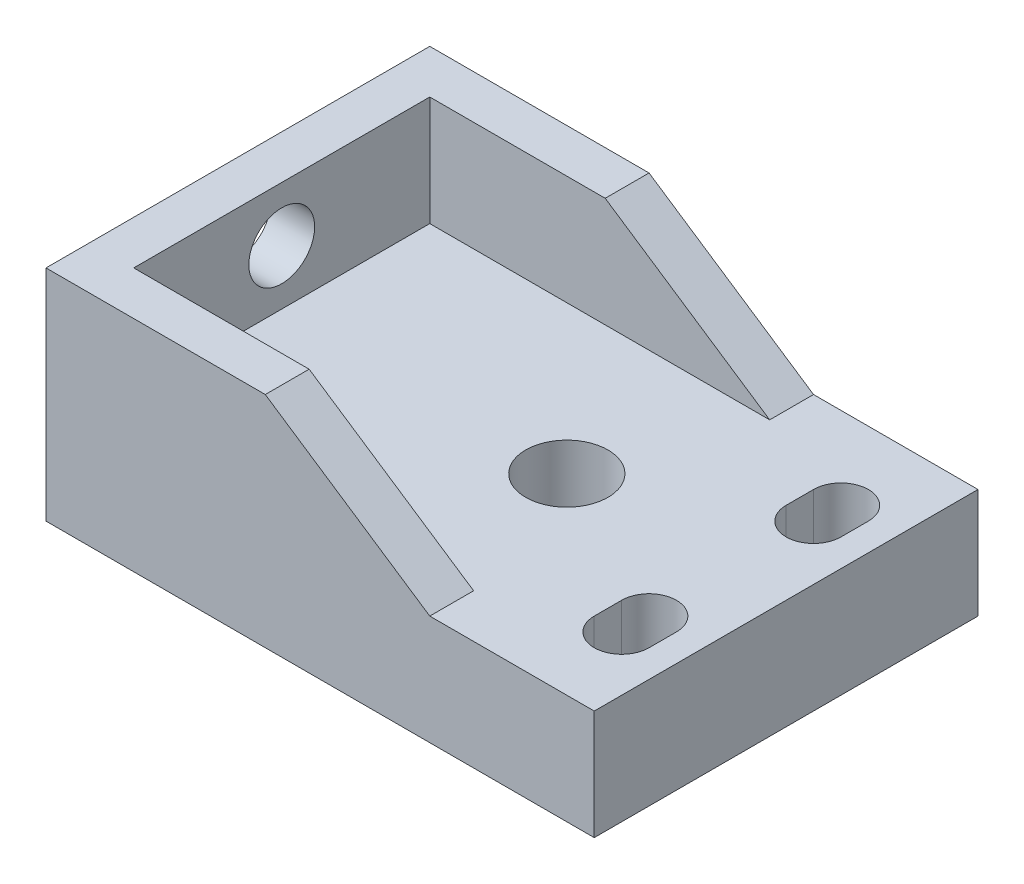
ISO-10303-21;
HEADER;
FILE_DESCRIPTION(('STEP AP214'),'2;1');
FILE_NAME('part.step','',(''),(''),'','','');
FILE_SCHEMA(('AUTOMOTIVE_DESIGN { 1 0 10303 214 1 1 1 1 }'));
ENDSEC;
DATA;
#1=APPLICATION_CONTEXT('core data for automotive mechanical design processes');
#2=APPLICATION_PROTOCOL_DEFINITION('international standard','automotive_design',2000,#1);
#3=PRODUCT_CONTEXT('',#1,'mechanical');
#4=PRODUCT('Part','Part','',(#3));
#5=PRODUCT_RELATED_PRODUCT_CATEGORY('part','',(#4));
#6=PRODUCT_DEFINITION_FORMATION('','',#4);
#7=PRODUCT_DEFINITION_CONTEXT('part definition',#1,'design');
#8=PRODUCT_DEFINITION('design','',#6,#7);
#9=PRODUCT_DEFINITION_SHAPE('','',#8);
#10=(LENGTH_UNIT() NAMED_UNIT(*) SI_UNIT(.MILLI.,.METRE.));
#11=(NAMED_UNIT(*) PLANE_ANGLE_UNIT() SI_UNIT($,.RADIAN.));
#12=(NAMED_UNIT(*) SI_UNIT($,.STERADIAN.) SOLID_ANGLE_UNIT());
#13=UNCERTAINTY_MEASURE_WITH_UNIT(LENGTH_MEASURE(1.E-05),#10,'distance_accuracy_value','');
#14=(GEOMETRIC_REPRESENTATION_CONTEXT(3) GLOBAL_UNCERTAINTY_ASSIGNED_CONTEXT((#13)) GLOBAL_UNIT_ASSIGNED_CONTEXT((#10,
#11,#12)) REPRESENTATION_CONTEXT('',''));
#15=CARTESIAN_POINT('',(0.,0.,0.));
#16=DIRECTION('',(0.,0.,1.));
#17=DIRECTION('',(1.,0.,0.));
#18=AXIS2_PLACEMENT_3D('',#15,#16,#17);
#19=CARTESIAN_POINT('',(0.,0.,70.));
#20=DIRECTION('',(0.,-1.,0.));
#21=DIRECTION('',(1.,0.,0.));
#22=AXIS2_PLACEMENT_3D('',#19,#20,#21);
#23=PLANE('',#22);
#24=DIRECTION('',(1.,0.,0.));
#25=VECTOR('',#24,1.);
#26=CARTESIAN_POINT('',(42.,0.,62.));
#27=LINE('',#26,#25);
#28=CARTESIAN_POINT('',(-42.,0.,62.));
#29=VERTEX_POINT('',#28);
#30=CARTESIAN_POINT('',(20.,0.,62.));
#31=VERTEX_POINT('',#30);
#32=EDGE_CURVE('E242',#29,#31,#27,.T.);
#33=ORIENTED_EDGE('',*,*,#32,.T.);
#34=DIRECTION('',(0.,0.,-1.));
#35=VECTOR('',#34,1.);
#36=CARTESIAN_POINT('',(20.,0.,70.));
#37=LINE('',#36,#35);
#38=CARTESIAN_POINT('',(20.,0.,70.));
#39=VERTEX_POINT('',#38);
#40=EDGE_CURVE('E44',#39,#31,#37,.T.);
#41=ORIENTED_EDGE('',*,*,#40,.F.);
#42=DIRECTION('',(-1.,0.,0.));
#43=VECTOR('',#42,1.);
#44=CARTESIAN_POINT('',(0.,0.,70.));
#45=LINE('',#44,#43);
#46=CARTESIAN_POINT('',(50.,0.,70.));
#47=VERTEX_POINT('',#46);
#48=EDGE_CURVE('E263',#47,#39,#45,.T.);
#49=ORIENTED_EDGE('',*,*,#48,.F.);
#50=DIRECTION('',(0.,0.,-1.));
#51=VECTOR('',#50,1.);
#52=CARTESIAN_POINT('',(50.,0.,70.));
#53=LINE('',#52,#51);
#54=CARTESIAN_POINT('',(50.,0.,0.));
#55=VERTEX_POINT('',#54);
#56=EDGE_CURVE('E279',#47,#55,#53,.T.);
#57=ORIENTED_EDGE('',*,*,#56,.T.);
#58=DIRECTION('',(-1.,0.,0.));
#59=VECTOR('',#58,1.);
#60=CARTESIAN_POINT('',(0.,0.,0.));
#61=LINE('',#60,#59);
#62=CARTESIAN_POINT('',(20.,0.,0.));
#63=VERTEX_POINT('',#62);
#64=EDGE_CURVE('E262',#55,#63,#61,.T.);
#65=ORIENTED_EDGE('',*,*,#64,.T.);
#66=CARTESIAN_POINT('',(20.,0.,8.));
#67=VERTEX_POINT('',#66);
#68=EDGE_CURVE('E306',#67,#63,#37,.T.);
#69=ORIENTED_EDGE('',*,*,#68,.F.);
#70=DIRECTION('',(-1.,0.,0.));
#71=VECTOR('',#70,1.);
#72=CARTESIAN_POINT('',(42.,0.,8.));
#73=LINE('',#72,#71);
#74=CARTESIAN_POINT('',(-42.,0.,8.));
#75=VERTEX_POINT('',#74);
#76=EDGE_CURVE('E247',#67,#75,#73,.T.);
#77=ORIENTED_EDGE('',*,*,#76,.T.);
#78=DIRECTION('',(0.,0.,1.));
#79=VECTOR('',#78,1.);
#80=CARTESIAN_POINT('',(-42.,0.,62.));
#81=LINE('',#80,#79);
#82=EDGE_CURVE('E248',#75,#29,#81,.T.);
#83=ORIENTED_EDGE('',*,*,#82,.T.);
#84=EDGE_LOOP('',(#33,#41,#49,#57,#65,#69,#77,#83));
#85=FACE_BOUND('',#84,.T.);
#86=CARTESIAN_POINT('',(9.99999999999999,0.,35.));
#87=DIRECTION('',(0.,1.,0.));
#88=DIRECTION('',(-1.,0.,0.));
#89=AXIS2_PLACEMENT_3D('',#86,#87,#88);
#90=CIRCLE('',#89,7.5);
#91=CARTESIAN_POINT('',(2.5,0.,35.));
#92=VERTEX_POINT('',#91);
#93=EDGE_CURVE('E227',#92,#92,#90,.T.);
#94=ORIENTED_EDGE('',*,*,#93,.F.);
#95=EDGE_LOOP('',(#94));
#96=FACE_BOUND('',#95,.T.);
#97=CARTESIAN_POINT('',(40.,0.,15.));
#98=DIRECTION('',(0.,1.,0.));
#99=DIRECTION('',(-1.,0.,0.));
#100=AXIS2_PLACEMENT_3D('',#97,#98,#99);
#101=CIRCLE('',#100,5.);
#102=CARTESIAN_POINT('',(45.,0.,15.));
#103=VERTEX_POINT('',#102);
#104=CARTESIAN_POINT('',(35.,0.,15.));
#105=VERTEX_POINT('',#104);
#106=EDGE_CURVE('E217',#103,#105,#101,.T.);
#107=ORIENTED_EDGE('',*,*,#106,.F.);
#108=DIRECTION('',(0.,0.,-1.));
#109=VECTOR('',#108,1.);
#110=CARTESIAN_POINT('',(45.,0.,20.));
#111=LINE('',#110,#109);
#112=CARTESIAN_POINT('',(45.,0.,20.));
#113=VERTEX_POINT('',#112);
#114=EDGE_CURVE('E198',#113,#103,#111,.T.);
#115=ORIENTED_EDGE('',*,*,#114,.F.);
#116=CARTESIAN_POINT('',(40.,0.,20.));
#117=DIRECTION('',(0.,1.,0.));
#118=DIRECTION('',(-1.,0.,0.));
#119=AXIS2_PLACEMENT_3D('',#116,#117,#118);
#120=CIRCLE('',#119,5.);
#121=CARTESIAN_POINT('',(35.,0.,20.));
#122=VERTEX_POINT('',#121);
#123=EDGE_CURVE('E206',#122,#113,#120,.T.);
#124=ORIENTED_EDGE('',*,*,#123,.F.);
#125=DIRECTION('',(0.,0.,-1.));
#126=VECTOR('',#125,1.);
#127=CARTESIAN_POINT('',(35.,0.,20.));
#128=LINE('',#127,#126);
#129=EDGE_CURVE('E220',#122,#105,#128,.T.);
#130=ORIENTED_EDGE('',*,*,#129,.T.);
#131=EDGE_LOOP('',(#107,#115,#124,#130));
#132=FACE_BOUND('',#131,.T.);
#133=DIRECTION('',(0.,0.,1.));
#134=VECTOR('',#133,1.);
#135=CARTESIAN_POINT('',(45.,0.,50.));
#136=LINE('',#135,#134);
#137=CARTESIAN_POINT('',(45.,0.,50.));
#138=VERTEX_POINT('',#137);
#139=CARTESIAN_POINT('',(45.,0.,55.));
#140=VERTEX_POINT('',#139);
#141=EDGE_CURVE('E51',#138,#140,#136,.T.);
#142=ORIENTED_EDGE('',*,*,#141,.T.);
#143=CARTESIAN_POINT('',(40.,0.,55.));
#144=DIRECTION('',(0.,-1.,0.));
#145=DIRECTION('',(-1.,0.,0.));
#146=AXIS2_PLACEMENT_3D('',#143,#144,#145);
#147=CIRCLE('',#146,5.);
#148=CARTESIAN_POINT('',(35.,0.,55.));
#149=VERTEX_POINT('',#148);
#150=EDGE_CURVE('E179',#140,#149,#147,.T.);
#151=ORIENTED_EDGE('',*,*,#150,.T.);
#152=DIRECTION('',(0.,0.,1.));
#153=VECTOR('',#152,1.);
#154=CARTESIAN_POINT('',(35.,0.,50.));
#155=LINE('',#154,#153);
#156=CARTESIAN_POINT('',(35.,0.,50.));
#157=VERTEX_POINT('',#156);
#158=EDGE_CURVE('E182',#157,#149,#155,.T.);
#159=ORIENTED_EDGE('',*,*,#158,.F.);
#160=CARTESIAN_POINT('',(40.,0.,50.));
#161=DIRECTION('',(0.,-1.,0.));
#162=DIRECTION('',(-1.,0.,0.));
#163=AXIS2_PLACEMENT_3D('',#160,#161,#162);
#164=CIRCLE('',#163,5.);
#165=EDGE_CURVE('E191',#157,#138,#164,.T.);
#166=ORIENTED_EDGE('',*,*,#165,.T.);
#167=EDGE_LOOP('',(#142,#151,#159,#166));
#168=FACE_BOUND('',#167,.T.);
#169=ADVANCED_FACE('F37',(#85,#96,#132,#168),#23,.F.);
#170=CARTESIAN_POINT('',(0.,-20.,70.));
#171=DIRECTION('',(0.,1.,0.));
#172=DIRECTION('',(0.,0.,1.));
#173=AXIS2_PLACEMENT_3D('',#170,#171,#172);
#174=PLANE('',#173);
#175=DIRECTION('',(1.,0.,0.));
#176=VECTOR('',#175,1.);
#177=CARTESIAN_POINT('',(0.,-20.,0.));
#178=LINE('',#177,#176);
#179=CARTESIAN_POINT('',(-50.,-20.,0.));
#180=VERTEX_POINT('',#179);
#181=CARTESIAN_POINT('',(50.,-20.,0.));
#182=VERTEX_POINT('',#181);
#183=EDGE_CURVE('E291',#180,#182,#178,.T.);
#184=ORIENTED_EDGE('',*,*,#183,.T.);
#185=DIRECTION('',(0.,0.,-1.));
#186=VECTOR('',#185,1.);
#187=CARTESIAN_POINT('',(50.,-20.,70.));
#188=LINE('',#187,#186);
#189=CARTESIAN_POINT('',(50.,-20.,70.));
#190=VERTEX_POINT('',#189);
#191=EDGE_CURVE('E296',#190,#182,#188,.T.);
#192=ORIENTED_EDGE('',*,*,#191,.F.);
#193=DIRECTION('',(1.,0.,0.));
#194=VECTOR('',#193,1.);
#195=CARTESIAN_POINT('',(0.,-20.,70.));
#196=LINE('',#195,#194);
#197=CARTESIAN_POINT('',(-50.,-20.,70.));
#198=VERTEX_POINT('',#197);
#199=EDGE_CURVE('E275',#198,#190,#196,.T.);
#200=ORIENTED_EDGE('',*,*,#199,.F.);
#201=DIRECTION('',(0.,0.,-1.));
#202=VECTOR('',#201,1.);
#203=CARTESIAN_POINT('',(-50.,-20.,70.));
#204=LINE('',#203,#202);
#205=EDGE_CURVE('E299',#198,#180,#204,.T.);
#206=ORIENTED_EDGE('',*,*,#205,.T.);
#207=EDGE_LOOP('',(#184,#192,#200,#206));
#208=FACE_BOUND('',#207,.T.);
#209=CARTESIAN_POINT('',(10.,-20.,35.));
#210=DIRECTION('',(0.,1.,0.));
#211=DIRECTION('',(-1.,0.,0.));
#212=AXIS2_PLACEMENT_3D('',#209,#210,#211);
#213=CIRCLE('',#212,7.5);
#214=CARTESIAN_POINT('',(2.5,-20.,35.));
#215=VERTEX_POINT('',#214);
#216=EDGE_CURVE('E234',#215,#215,#213,.T.);
#217=ORIENTED_EDGE('',*,*,#216,.T.);
#218=EDGE_LOOP('',(#217));
#219=FACE_BOUND('',#218,.T.);
#220=CARTESIAN_POINT('',(40.,-20.,20.));
#221=DIRECTION('',(0.,1.,0.));
#222=DIRECTION('',(-1.,0.,0.));
#223=AXIS2_PLACEMENT_3D('',#220,#221,#222);
#224=CIRCLE('',#223,5.);
#225=CARTESIAN_POINT('',(35.,-20.,20.));
#226=VERTEX_POINT('',#225);
#227=CARTESIAN_POINT('',(45.,-20.,20.));
#228=VERTEX_POINT('',#227);
#229=EDGE_CURVE('E212',#226,#228,#224,.T.);
#230=ORIENTED_EDGE('',*,*,#229,.T.);
#231=DIRECTION('',(0.,0.,-1.));
#232=VECTOR('',#231,1.);
#233=CARTESIAN_POINT('',(45.,-20.,20.));
#234=LINE('',#233,#232);
#235=CARTESIAN_POINT('',(45.,-20.,15.));
#236=VERTEX_POINT('',#235);
#237=EDGE_CURVE('E202',#228,#236,#234,.T.);
#238=ORIENTED_EDGE('',*,*,#237,.T.);
#239=CARTESIAN_POINT('',(40.,-20.,15.));
#240=DIRECTION('',(0.,1.,0.));
#241=DIRECTION('',(-1.,0.,0.));
#242=AXIS2_PLACEMENT_3D('',#239,#240,#241);
#243=CIRCLE('',#242,5.);
#244=CARTESIAN_POINT('',(35.,-20.,15.));
#245=VERTEX_POINT('',#244);
#246=EDGE_CURVE('E205',#236,#245,#243,.T.);
#247=ORIENTED_EDGE('',*,*,#246,.T.);
#248=DIRECTION('',(0.,0.,-1.));
#249=VECTOR('',#248,1.);
#250=CARTESIAN_POINT('',(35.,-20.,20.));
#251=LINE('',#250,#249);
#252=EDGE_CURVE('E209',#226,#245,#251,.T.);
#253=ORIENTED_EDGE('',*,*,#252,.F.);
#254=EDGE_LOOP('',(#230,#238,#247,#253));
#255=FACE_BOUND('',#254,.T.);
#256=DIRECTION('',(0.,0.,1.));
#257=VECTOR('',#256,1.);
#258=CARTESIAN_POINT('',(45.,-20.,50.));
#259=LINE('',#258,#257);
#260=CARTESIAN_POINT('',(45.,-20.,50.));
#261=VERTEX_POINT('',#260);
#262=CARTESIAN_POINT('',(45.,-20.,55.));
#263=VERTEX_POINT('',#262);
#264=EDGE_CURVE('E171',#261,#263,#259,.T.);
#265=ORIENTED_EDGE('',*,*,#264,.F.);
#266=CARTESIAN_POINT('',(40.,-20.,50.));
#267=DIRECTION('',(0.,-1.,0.));
#268=DIRECTION('',(-1.,0.,0.));
#269=AXIS2_PLACEMENT_3D('',#266,#267,#268);
#270=CIRCLE('',#269,5.);
#271=CARTESIAN_POINT('',(35.,-20.,50.));
#272=VERTEX_POINT('',#271);
#273=EDGE_CURVE('E163',#272,#261,#270,.T.);
#274=ORIENTED_EDGE('',*,*,#273,.F.);
#275=DIRECTION('',(0.,0.,1.));
#276=VECTOR('',#275,1.);
#277=CARTESIAN_POINT('',(35.,-20.,50.));
#278=LINE('',#277,#276);
#279=CARTESIAN_POINT('',(35.,-20.,55.));
#280=VERTEX_POINT('',#279);
#281=EDGE_CURVE('E59',#272,#280,#278,.T.);
#282=ORIENTED_EDGE('',*,*,#281,.T.);
#283=CARTESIAN_POINT('',(40.,-20.,55.));
#284=DIRECTION('',(0.,-1.,0.));
#285=DIRECTION('',(-1.,0.,0.));
#286=AXIS2_PLACEMENT_3D('',#283,#284,#285);
#287=CIRCLE('',#286,5.);
#288=EDGE_CURVE('E175',#263,#280,#287,.T.);
#289=ORIENTED_EDGE('',*,*,#288,.F.);
#290=EDGE_LOOP('',(#265,#274,#282,#289));
#291=FACE_BOUND('',#290,.T.);
#292=ADVANCED_FACE('F178',(#208,#219,#255,#291),#174,.F.);
#293=CARTESIAN_POINT('',(6.15384615384615,9.23076923076923,70.));
#294=DIRECTION('',(-0.554700196225229,-0.832050294337844,0.));
#295=DIRECTION('',(0.832050294337844,-0.554700196225229,0.));
#296=AXIS2_PLACEMENT_3D('',#293,#294,#295);
#297=PLANE('',#296);
#298=ORIENTED_EDGE('',*,*,#40,.T.);
#299=DIRECTION('',(-0.832050294337844,0.554700196225229,0.));
#300=VECTOR('',#299,1.);
#301=CARTESIAN_POINT('',(6.15384615384615,9.23076923076923,62.));
#302=LINE('',#301,#300);
#303=CARTESIAN_POINT('',(-10.,20.,62.));
#304=VERTEX_POINT('',#303);
#305=EDGE_CURVE('E259',#31,#304,#302,.T.);
#306=ORIENTED_EDGE('',*,*,#305,.T.);
#307=DIRECTION('',(0.,0.,-1.));
#308=VECTOR('',#307,1.);
#309=CARTESIAN_POINT('',(-10.,20.,70.));
#310=LINE('',#309,#308);
#311=CARTESIAN_POINT('',(-10.,20.,70.));
#312=VERTEX_POINT('',#311);
#313=EDGE_CURVE('E304',#312,#304,#310,.T.);
#314=ORIENTED_EDGE('',*,*,#313,.F.);
#315=DIRECTION('',(-0.832050294337844,0.554700196225229,0.));
#316=VECTOR('',#315,1.);
#317=CARTESIAN_POINT('',(6.15384615384615,9.23076923076923,70.));
#318=LINE('',#317,#316);
#319=EDGE_CURVE('E266',#39,#312,#318,.T.);
#320=ORIENTED_EDGE('',*,*,#319,.F.);
#321=EDGE_LOOP('',(#298,#306,#314,#320));
#322=FACE_BOUND('',#321,.T.);
#323=ADVANCED_FACE('F351',(#322),#297,.F.);
#324=CARTESIAN_POINT('',(-10.,20.,8.));
#325=VERTEX_POINT('',#324);
#326=CARTESIAN_POINT('',(-10.,20.,0.));
#327=VERTEX_POINT('',#326);
#328=EDGE_CURVE('E303',#325,#327,#310,.T.);
#329=ORIENTED_EDGE('',*,*,#328,.F.);
#330=DIRECTION('',(0.832050294337844,-0.554700196225229,0.));
#331=VECTOR('',#330,1.);
#332=CARTESIAN_POINT('',(6.15384615384615,9.23076923076923,8.));
#333=LINE('',#332,#331);
#334=EDGE_CURVE('E256',#325,#67,#333,.T.);
#335=ORIENTED_EDGE('',*,*,#334,.T.);
#336=ORIENTED_EDGE('',*,*,#68,.T.);
#337=DIRECTION('',(-0.832050294337844,0.554700196225229,0.));
#338=VECTOR('',#337,1.);
#339=CARTESIAN_POINT('',(6.15384615384615,9.23076923076923,0.));
#340=LINE('',#339,#338);
#341=EDGE_CURVE('E282',#63,#327,#340,.T.);
#342=ORIENTED_EDGE('',*,*,#341,.T.);
#343=EDGE_LOOP('',(#329,#335,#336,#342));
#344=FACE_BOUND('',#343,.T.);
#345=ADVANCED_FACE('F314',(#344),#297,.F.);
#346=CARTESIAN_POINT('',(0.,20.,70.));
#347=DIRECTION('',(0.,1.,0.));
#348=DIRECTION('',(-1.,0.,0.));
#349=AXIS2_PLACEMENT_3D('',#346,#347,#348);
#350=PLANE('',#349);
#351=DIRECTION('',(1.,0.,0.));
#352=VECTOR('',#351,1.);
#353=CARTESIAN_POINT('',(42.,20.,62.));
#354=LINE('',#353,#352);
#355=CARTESIAN_POINT('',(-42.,20.,62.));
#356=VERTEX_POINT('',#355);
#357=EDGE_CURVE('E240',#356,#304,#354,.T.);
#358=ORIENTED_EDGE('',*,*,#357,.F.);
#359=DIRECTION('',(0.,0.,1.));
#360=VECTOR('',#359,1.);
#361=CARTESIAN_POINT('',(-42.,20.,62.));
#362=LINE('',#361,#360);
#363=CARTESIAN_POINT('',(-42.,20.,8.));
#364=VERTEX_POINT('',#363);
#365=EDGE_CURVE('E237',#364,#356,#362,.T.);
#366=ORIENTED_EDGE('',*,*,#365,.F.);
#367=DIRECTION('',(-1.,0.,0.));
#368=VECTOR('',#367,1.);
#369=CARTESIAN_POINT('',(0.,20.,8.));
#370=LINE('',#369,#368);
#371=EDGE_CURVE('E11',#325,#364,#370,.T.);
#372=ORIENTED_EDGE('',*,*,#371,.F.);
#373=ORIENTED_EDGE('',*,*,#328,.T.);
#374=DIRECTION('',(1.,0.,0.));
#375=VECTOR('',#374,1.);
#376=CARTESIAN_POINT('',(0.,20.,0.));
#377=LINE('',#376,#375);
#378=CARTESIAN_POINT('',(-50.,20.,0.));
#379=VERTEX_POINT('',#378);
#380=EDGE_CURVE('E285',#379,#327,#377,.T.);
#381=ORIENTED_EDGE('',*,*,#380,.F.);
#382=DIRECTION('',(0.,0.,-1.));
#383=VECTOR('',#382,1.);
#384=CARTESIAN_POINT('',(-50.,20.,70.));
#385=LINE('',#384,#383);
#386=CARTESIAN_POINT('',(-50.,20.,70.));
#387=VERTEX_POINT('',#386);
#388=EDGE_CURVE('E301',#387,#379,#385,.T.);
#389=ORIENTED_EDGE('',*,*,#388,.F.);
#390=DIRECTION('',(1.,0.,0.));
#391=VECTOR('',#390,1.);
#392=CARTESIAN_POINT('',(0.,20.,70.));
#393=LINE('',#392,#391);
#394=EDGE_CURVE('E269',#387,#312,#393,.T.);
#395=ORIENTED_EDGE('',*,*,#394,.T.);
#396=ORIENTED_EDGE('',*,*,#313,.T.);
#397=EDGE_LOOP('',(#358,#366,#372,#373,#381,#389,#395,#396));
#398=FACE_BOUND('',#397,.T.);
#399=ADVANCED_FACE('F338',(#398),#350,.T.);
#400=CARTESIAN_POINT('',(-50.,0.,70.));
#401=DIRECTION('',(-1.,0.,0.));
#402=DIRECTION('',(0.,-1.,0.));
#403=AXIS2_PLACEMENT_3D('',#400,#401,#402);
#404=PLANE('',#403);
#405=CARTESIAN_POINT('',(-50.,9.99999999999999,35.));
#406=DIRECTION('',(1.,0.,0.));
#407=DIRECTION('',(0.,1.,0.));
#408=AXIS2_PLACEMENT_3D('',#405,#406,#407);
#409=CIRCLE('',#408,6.);
#410=CARTESIAN_POINT('',(-50.,16.,35.));
#411=VERTEX_POINT('',#410);
#412=EDGE_CURVE('E192',#411,#411,#409,.T.);
#413=ORIENTED_EDGE('',*,*,#412,.T.);
#414=EDGE_LOOP('',(#413));
#415=FACE_BOUND('',#414,.T.);
#416=DIRECTION('',(0.,1.,0.));
#417=VECTOR('',#416,1.);
#418=CARTESIAN_POINT('',(-50.,0.,0.));
#419=LINE('',#418,#417);
#420=EDGE_CURVE('E288',#180,#379,#419,.T.);
#421=ORIENTED_EDGE('',*,*,#420,.F.);
#422=ORIENTED_EDGE('',*,*,#205,.F.);
#423=DIRECTION('',(0.,1.,0.));
#424=VECTOR('',#423,1.);
#425=CARTESIAN_POINT('',(-50.,0.,70.));
#426=LINE('',#425,#424);
#427=EDGE_CURVE('E272',#198,#387,#426,.T.);
#428=ORIENTED_EDGE('',*,*,#427,.T.);
#429=ORIENTED_EDGE('',*,*,#388,.T.);
#430=EDGE_LOOP('',(#421,#422,#428,#429));
#431=FACE_BOUND('',#430,.T.);
#432=ADVANCED_FACE('F332',(#415,#431),#404,.T.);
#433=CARTESIAN_POINT('',(50.,0.,70.));
#434=DIRECTION('',(-1.,0.,0.));
#435=DIRECTION('',(0.,-1.,0.));
#436=AXIS2_PLACEMENT_3D('',#433,#434,#435);
#437=PLANE('',#436);
#438=DIRECTION('',(0.,1.,0.));
#439=VECTOR('',#438,1.);
#440=CARTESIAN_POINT('',(50.,0.,0.));
#441=LINE('',#440,#439);
#442=EDGE_CURVE('E267',#182,#55,#441,.T.);
#443=ORIENTED_EDGE('',*,*,#442,.T.);
#444=ORIENTED_EDGE('',*,*,#56,.F.);
#445=DIRECTION('',(0.,1.,0.));
#446=VECTOR('',#445,1.);
#447=CARTESIAN_POINT('',(50.,0.,70.));
#448=LINE('',#447,#446);
#449=EDGE_CURVE('E277',#190,#47,#448,.T.);
#450=ORIENTED_EDGE('',*,*,#449,.F.);
#451=ORIENTED_EDGE('',*,*,#191,.T.);
#452=EDGE_LOOP('',(#443,#444,#450,#451));
#453=FACE_BOUND('',#452,.T.);
#454=ADVANCED_FACE('F326',(#453),#437,.F.);
#455=CARTESIAN_POINT('',(0.,0.,70.));
#456=DIRECTION('',(0.,0.,1.));
#457=DIRECTION('',(1.,0.,0.));
#458=AXIS2_PLACEMENT_3D('',#455,#456,#457);
#459=PLANE('',#458);
#460=ORIENTED_EDGE('',*,*,#48,.T.);
#461=ORIENTED_EDGE('',*,*,#319,.T.);
#462=ORIENTED_EDGE('',*,*,#394,.F.);
#463=ORIENTED_EDGE('',*,*,#427,.F.);
#464=ORIENTED_EDGE('',*,*,#199,.T.);
#465=ORIENTED_EDGE('',*,*,#449,.T.);
#466=EDGE_LOOP('',(#460,#461,#462,#463,#464,#465));
#467=FACE_BOUND('',#466,.T.);
#468=ADVANCED_FACE('F353',(#467),#459,.T.);
#469=CARTESIAN_POINT('',(0.,0.,0.));
#470=DIRECTION('',(0.,0.,1.));
#471=DIRECTION('',(1.,0.,0.));
#472=AXIS2_PLACEMENT_3D('',#469,#470,#471);
#473=PLANE('',#472);
#474=ORIENTED_EDGE('',*,*,#64,.F.);
#475=ORIENTED_EDGE('',*,*,#442,.F.);
#476=ORIENTED_EDGE('',*,*,#183,.F.);
#477=ORIENTED_EDGE('',*,*,#420,.T.);
#478=ORIENTED_EDGE('',*,*,#380,.T.);
#479=ORIENTED_EDGE('',*,*,#341,.F.);
#480=EDGE_LOOP('',(#474,#475,#476,#477,#478,#479));
#481=FACE_BOUND('',#480,.T.);
#482=ADVANCED_FACE('F318',(#481),#473,.F.);
#483=CARTESIAN_POINT('',(42.,-99.8599018625594,62.));
#484=DIRECTION('',(0.,0.,1.));
#485=DIRECTION('',(1.,0.,0.));
#486=AXIS2_PLACEMENT_3D('',#483,#484,#485);
#487=PLANE('',#486);
#488=ORIENTED_EDGE('',*,*,#32,.F.);
#489=DIRECTION('',(0.,1.,0.));
#490=VECTOR('',#489,1.);
#491=CARTESIAN_POINT('',(-42.,-99.8599018625595,62.));
#492=LINE('',#491,#490);
#493=EDGE_CURVE('E251',#29,#356,#492,.T.);
#494=ORIENTED_EDGE('',*,*,#493,.T.);
#495=ORIENTED_EDGE('',*,*,#357,.T.);
#496=ORIENTED_EDGE('',*,*,#305,.F.);
#497=EDGE_LOOP('',(#488,#494,#495,#496));
#498=FACE_BOUND('',#497,.T.);
#499=ADVANCED_FACE('F349',(#498),#487,.F.);
#500=CARTESIAN_POINT('',(42.,-99.8599018625594,8.));
#501=DIRECTION('',(0.,0.,-1.));
#502=DIRECTION('',(-1.,0.,0.));
#503=AXIS2_PLACEMENT_3D('',#500,#501,#502);
#504=PLANE('',#503);
#505=ORIENTED_EDGE('',*,*,#371,.T.);
#506=DIRECTION('',(0.,1.,0.));
#507=VECTOR('',#506,1.);
#508=CARTESIAN_POINT('',(-42.,-99.8599018625595,8.));
#509=LINE('',#508,#507);
#510=EDGE_CURVE('E252',#75,#364,#509,.T.);
#511=ORIENTED_EDGE('',*,*,#510,.F.);
#512=ORIENTED_EDGE('',*,*,#76,.F.);
#513=ORIENTED_EDGE('',*,*,#334,.F.);
#514=EDGE_LOOP('',(#505,#511,#512,#513));
#515=FACE_BOUND('',#514,.T.);
#516=ADVANCED_FACE('F343',(#515),#504,.F.);
#517=CARTESIAN_POINT('',(-42.,-99.8599018625595,62.));
#518=DIRECTION('',(-1.,0.,0.));
#519=DIRECTION('',(0.,-1.,0.));
#520=AXIS2_PLACEMENT_3D('',#517,#518,#519);
#521=PLANE('',#520);
#522=CARTESIAN_POINT('',(-42.,9.99999999999999,35.));
#523=DIRECTION('',(1.,0.,0.));
#524=DIRECTION('',(0.,1.,0.));
#525=AXIS2_PLACEMENT_3D('',#522,#523,#524);
#526=CIRCLE('',#525,6.);
#527=CARTESIAN_POINT('',(-42.,16.,35.));
#528=VERTEX_POINT('',#527);
#529=EDGE_CURVE('E185',#528,#528,#526,.T.);
#530=ORIENTED_EDGE('',*,*,#529,.F.);
#531=EDGE_LOOP('',(#530));
#532=FACE_BOUND('',#531,.T.);
#533=ORIENTED_EDGE('',*,*,#510,.T.);
#534=ORIENTED_EDGE('',*,*,#365,.T.);
#535=ORIENTED_EDGE('',*,*,#493,.F.);
#536=ORIENTED_EDGE('',*,*,#82,.F.);
#537=EDGE_LOOP('',(#533,#534,#535,#536));
#538=FACE_BOUND('',#537,.T.);
#539=ADVANCED_FACE('F347',(#532,#538),#521,.F.);
#540=CARTESIAN_POINT('',(10.,-20.,35.));
#541=DIRECTION('',(0.,1.,0.));
#542=DIRECTION('',(-1.,0.,0.));
#543=AXIS2_PLACEMENT_3D('',#540,#541,#542);
#544=CYLINDRICAL_SURFACE('',#543,7.5);
#545=ORIENTED_EDGE('',*,*,#216,.F.);
#546=EDGE_LOOP('',(#545));
#547=FACE_BOUND('',#546,.T.);
#548=ORIENTED_EDGE('',*,*,#93,.T.);
#549=EDGE_LOOP('',(#548));
#550=FACE_BOUND('',#549,.T.);
#551=ADVANCED_FACE('F403',(#547,#550),#544,.F.);
#552=CARTESIAN_POINT('',(45.,-20.,20.));
#553=DIRECTION('',(1.,0.,0.));
#554=DIRECTION('',(0.,0.,-1.));
#555=AXIS2_PLACEMENT_3D('',#552,#553,#554);
#556=PLANE('',#555);
#557=ORIENTED_EDGE('',*,*,#114,.T.);
#558=DIRECTION('',(0.,1.,0.));
#559=VECTOR('',#558,1.);
#560=CARTESIAN_POINT('',(45.,-20.,15.));
#561=LINE('',#560,#559);
#562=EDGE_CURVE('E215',#236,#103,#561,.T.);
#563=ORIENTED_EDGE('',*,*,#562,.F.);
#564=ORIENTED_EDGE('',*,*,#237,.F.);
#565=DIRECTION('',(0.,1.,0.));
#566=VECTOR('',#565,1.);
#567=CARTESIAN_POINT('',(45.,-20.,20.));
#568=LINE('',#567,#566);
#569=EDGE_CURVE('E225',#228,#113,#568,.T.);
#570=ORIENTED_EDGE('',*,*,#569,.T.);
#571=EDGE_LOOP('',(#557,#563,#564,#570));
#572=FACE_BOUND('',#571,.T.);
#573=ADVANCED_FACE('F368',(#572),#556,.F.);
#574=CARTESIAN_POINT('',(40.,-20.,20.));
#575=DIRECTION('',(0.,1.,0.));
#576=DIRECTION('',(-1.,0.,0.));
#577=AXIS2_PLACEMENT_3D('',#574,#575,#576);
#578=CYLINDRICAL_SURFACE('',#577,5.);
#579=ORIENTED_EDGE('',*,*,#123,.T.);
#580=ORIENTED_EDGE('',*,*,#569,.F.);
#581=ORIENTED_EDGE('',*,*,#229,.F.);
#582=DIRECTION('',(0.,1.,0.));
#583=VECTOR('',#582,1.);
#584=CARTESIAN_POINT('',(35.,-20.,20.));
#585=LINE('',#584,#583);
#586=EDGE_CURVE('E228',#226,#122,#585,.T.);
#587=ORIENTED_EDGE('',*,*,#586,.T.);
#588=EDGE_LOOP('',(#579,#580,#581,#587));
#589=FACE_BOUND('',#588,.T.);
#590=ADVANCED_FACE('F363',(#589),#578,.F.);
#591=CARTESIAN_POINT('',(35.,-20.,20.));
#592=DIRECTION('',(1.,0.,0.));
#593=DIRECTION('',(0.,1.,0.));
#594=AXIS2_PLACEMENT_3D('',#591,#592,#593);
#595=PLANE('',#594);
#596=ORIENTED_EDGE('',*,*,#129,.F.);
#597=ORIENTED_EDGE('',*,*,#586,.F.);
#598=ORIENTED_EDGE('',*,*,#252,.T.);
#599=DIRECTION('',(0.,1.,0.));
#600=VECTOR('',#599,1.);
#601=CARTESIAN_POINT('',(35.,-20.,15.));
#602=LINE('',#601,#600);
#603=EDGE_CURVE('E230',#245,#105,#602,.T.);
#604=ORIENTED_EDGE('',*,*,#603,.T.);
#605=EDGE_LOOP('',(#596,#597,#598,#604));
#606=FACE_BOUND('',#605,.T.);
#607=ADVANCED_FACE('F374',(#606),#595,.T.);
#608=CARTESIAN_POINT('',(40.,-20.,15.));
#609=DIRECTION('',(0.,1.,0.));
#610=DIRECTION('',(-1.,0.,0.));
#611=AXIS2_PLACEMENT_3D('',#608,#609,#610);
#612=CYLINDRICAL_SURFACE('',#611,5.);
#613=ORIENTED_EDGE('',*,*,#106,.T.);
#614=ORIENTED_EDGE('',*,*,#603,.F.);
#615=ORIENTED_EDGE('',*,*,#246,.F.);
#616=ORIENTED_EDGE('',*,*,#562,.T.);
#617=EDGE_LOOP('',(#613,#614,#615,#616));
#618=FACE_BOUND('',#617,.T.);
#619=ADVANCED_FACE('F372',(#618),#612,.F.);
#620=CARTESIAN_POINT('',(45.,-20.,50.));
#621=DIRECTION('',(-1.,0.,0.));
#622=DIRECTION('',(0.,0.,1.));
#623=AXIS2_PLACEMENT_3D('',#620,#621,#622);
#624=PLANE('',#623);
#625=ORIENTED_EDGE('',*,*,#141,.F.);
#626=DIRECTION('',(0.,1.,0.));
#627=VECTOR('',#626,1.);
#628=CARTESIAN_POINT('',(45.,-20.,50.));
#629=LINE('',#628,#627);
#630=EDGE_CURVE('E166',#261,#138,#629,.T.);
#631=ORIENTED_EDGE('',*,*,#630,.F.);
#632=ORIENTED_EDGE('',*,*,#264,.T.);
#633=DIRECTION('',(0.,1.,0.));
#634=VECTOR('',#633,1.);
#635=CARTESIAN_POINT('',(45.,-20.,55.));
#636=LINE('',#635,#634);
#637=EDGE_CURVE('E196',#263,#140,#636,.T.);
#638=ORIENTED_EDGE('',*,*,#637,.T.);
#639=EDGE_LOOP('',(#625,#631,#632,#638));
#640=FACE_BOUND('',#639,.T.);
#641=ADVANCED_FACE('F173',(#640),#624,.T.);
#642=CARTESIAN_POINT('',(40.,-20.,55.));
#643=DIRECTION('',(0.,1.,0.));
#644=DIRECTION('',(-1.,0.,0.));
#645=AXIS2_PLACEMENT_3D('',#642,#643,#644);
#646=CYLINDRICAL_SURFACE('',#645,5.);
#647=ORIENTED_EDGE('',*,*,#150,.F.);
#648=ORIENTED_EDGE('',*,*,#637,.F.);
#649=ORIENTED_EDGE('',*,*,#288,.T.);
#650=DIRECTION('',(0.,1.,0.));
#651=VECTOR('',#650,1.);
#652=CARTESIAN_POINT('',(35.,-20.,55.));
#653=LINE('',#652,#651);
#654=EDGE_CURVE('E199',#280,#149,#653,.T.);
#655=ORIENTED_EDGE('',*,*,#654,.T.);
#656=EDGE_LOOP('',(#647,#648,#649,#655));
#657=FACE_BOUND('',#656,.T.);
#658=ADVANCED_FACE('F381',(#657),#646,.F.);
#659=CARTESIAN_POINT('',(35.,-20.,50.));
#660=DIRECTION('',(-1.,0.,0.));
#661=DIRECTION('',(0.,-1.,0.));
#662=AXIS2_PLACEMENT_3D('',#659,#660,#661);
#663=PLANE('',#662);
#664=ORIENTED_EDGE('',*,*,#158,.T.);
#665=ORIENTED_EDGE('',*,*,#654,.F.);
#666=ORIENTED_EDGE('',*,*,#281,.F.);
#667=DIRECTION('',(0.,1.,0.));
#668=VECTOR('',#667,1.);
#669=CARTESIAN_POINT('',(35.,-20.,50.));
#670=LINE('',#669,#668);
#671=EDGE_CURVE('E168',#272,#157,#670,.T.);
#672=ORIENTED_EDGE('',*,*,#671,.T.);
#673=EDGE_LOOP('',(#664,#665,#666,#672));
#674=FACE_BOUND('',#673,.T.);
#675=ADVANCED_FACE('F379',(#674),#663,.F.);
#676=CARTESIAN_POINT('',(40.,-20.,50.));
#677=DIRECTION('',(0.,1.,0.));
#678=DIRECTION('',(-1.,0.,0.));
#679=AXIS2_PLACEMENT_3D('',#676,#677,#678);
#680=CYLINDRICAL_SURFACE('',#679,5.);
#681=ORIENTED_EDGE('',*,*,#165,.F.);
#682=ORIENTED_EDGE('',*,*,#671,.F.);
#683=ORIENTED_EDGE('',*,*,#273,.T.);
#684=ORIENTED_EDGE('',*,*,#630,.T.);
#685=EDGE_LOOP('',(#681,#682,#683,#684));
#686=FACE_BOUND('',#685,.T.);
#687=ADVANCED_FACE('F165',(#686),#680,.F.);
#688=CARTESIAN_POINT('',(-50.,9.99999999999999,35.));
#689=DIRECTION('',(1.,0.,0.));
#690=DIRECTION('',(0.,1.,0.));
#691=AXIS2_PLACEMENT_3D('',#688,#689,#690);
#692=CYLINDRICAL_SURFACE('',#691,6.);
#693=ORIENTED_EDGE('',*,*,#412,.F.);
#694=EDGE_LOOP('',(#693));
#695=FACE_BOUND('',#694,.T.);
#696=ORIENTED_EDGE('',*,*,#529,.T.);
#697=EDGE_LOOP('',(#696));
#698=FACE_BOUND('',#697,.T.);
#699=ADVANCED_FACE('F391',(#695,#698),#692,.F.);
#700=CLOSED_SHELL('',(#169,#292,#323,#345,#399,#432,#454,#468,#482,#499,#516,#539,#551,#573,
#590,#607,#619,#641,#658,#675,#687,#699));
#701=MANIFOLD_SOLID_BREP('B2',#700);
#702=ADVANCED_BREP_SHAPE_REPRESENTATION('',(#18,#701),#14);
#703=SHAPE_DEFINITION_REPRESENTATION(#9,#702);
ENDSEC;
END-ISO-10303-21;
